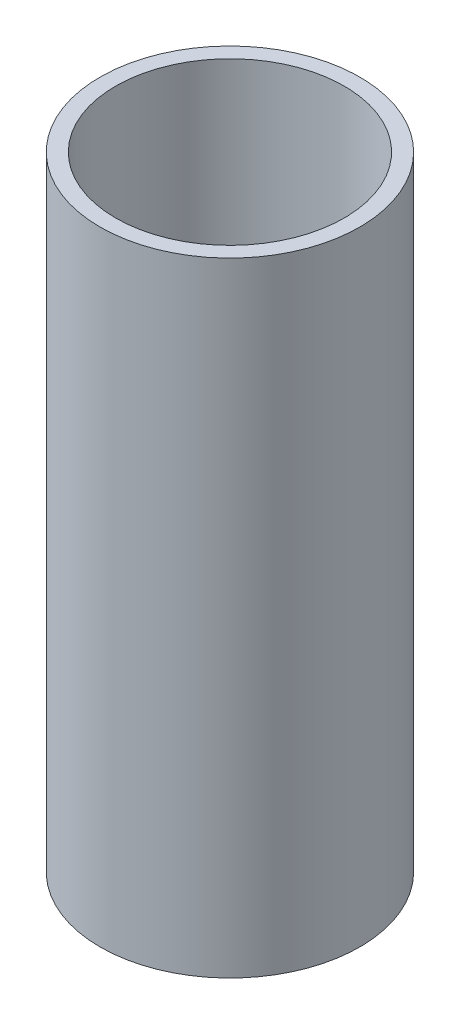
ISO-10303-21;
HEADER;
FILE_DESCRIPTION(('STEP AP214'),'2;1');
FILE_NAME('part.step','',(''),(''),'','','');
FILE_SCHEMA(('AUTOMOTIVE_DESIGN { 1 0 10303 214 1 1 1 1 }'));
ENDSEC;
DATA;
#1=APPLICATION_CONTEXT('core data for automotive mechanical design processes');
#2=APPLICATION_PROTOCOL_DEFINITION('international standard','automotive_design',2000,#1);
#3=PRODUCT_CONTEXT('',#1,'mechanical');
#4=PRODUCT('Part','Part','',(#3));
#5=PRODUCT_RELATED_PRODUCT_CATEGORY('part','',(#4));
#6=PRODUCT_DEFINITION_FORMATION('','',#4);
#7=PRODUCT_DEFINITION_CONTEXT('part definition',#1,'design');
#8=PRODUCT_DEFINITION('design','',#6,#7);
#9=PRODUCT_DEFINITION_SHAPE('','',#8);
#10=(LENGTH_UNIT() NAMED_UNIT(*) SI_UNIT(.MILLI.,.METRE.));
#11=(NAMED_UNIT(*) PLANE_ANGLE_UNIT() SI_UNIT($,.RADIAN.));
#12=(NAMED_UNIT(*) SI_UNIT($,.STERADIAN.) SOLID_ANGLE_UNIT());
#13=UNCERTAINTY_MEASURE_WITH_UNIT(LENGTH_MEASURE(1.E-05),#10,'distance_accuracy_value','');
#14=(GEOMETRIC_REPRESENTATION_CONTEXT(3) GLOBAL_UNCERTAINTY_ASSIGNED_CONTEXT((#13)) GLOBAL_UNIT_ASSIGNED_CONTEXT((#10,
#11,#12)) REPRESENTATION_CONTEXT('',''));
#15=CARTESIAN_POINT('',(0.,0.,0.));
#16=DIRECTION('',(0.,0.,1.));
#17=DIRECTION('',(1.,0.,0.));
#18=AXIS2_PLACEMENT_3D('',#15,#16,#17);
#19=CARTESIAN_POINT('',(0.,120.,0.));
#20=DIRECTION('',(0.,1.,0.));
#21=DIRECTION('',(0.,0.,1.));
#22=AXIS2_PLACEMENT_3D('',#19,#20,#21);
#23=PLANE('',#22);
#24=CARTESIAN_POINT('',(0.,120.,0.));
#25=DIRECTION('',(0.,1.,0.));
#26=DIRECTION('',(0.,0.,1.));
#27=AXIS2_PLACEMENT_3D('',#24,#25,#26);
#28=CIRCLE('',#27,25.);
#29=CARTESIAN_POINT('',(0.,120.,25.));
#30=VERTEX_POINT('',#29);
#31=EDGE_CURVE('E10',#30,#30,#28,.T.);
#32=ORIENTED_EDGE('',*,*,#31,.T.);
#33=EDGE_LOOP('',(#32));
#34=FACE_BOUND('',#33,.T.);
#35=CARTESIAN_POINT('',(0.,120.,0.));
#36=DIRECTION('',(0.,1.,0.));
#37=DIRECTION('',(0.,0.,1.));
#38=AXIS2_PLACEMENT_3D('',#35,#36,#37);
#39=CIRCLE('',#38,22.);
#40=CARTESIAN_POINT('',(0.,120.,22.));
#41=VERTEX_POINT('',#40);
#42=EDGE_CURVE('E42',#41,#41,#39,.T.);
#43=ORIENTED_EDGE('',*,*,#42,.F.);
#44=EDGE_LOOP('',(#43));
#45=FACE_BOUND('',#44,.T.);
#46=ADVANCED_FACE('F31',(#34,#45),#23,.T.);
#47=CARTESIAN_POINT('',(0.,0.,0.));
#48=DIRECTION('',(0.,1.,0.));
#49=DIRECTION('',(0.,0.,1.));
#50=AXIS2_PLACEMENT_3D('',#47,#48,#49);
#51=PLANE('',#50);
#52=CARTESIAN_POINT('',(0.,0.,0.));
#53=DIRECTION('',(0.,1.,0.));
#54=DIRECTION('',(0.,0.,1.));
#55=AXIS2_PLACEMENT_3D('',#52,#53,#54);
#56=CIRCLE('',#55,25.);
#57=CARTESIAN_POINT('',(0.,0.,25.));
#58=VERTEX_POINT('',#57);
#59=EDGE_CURVE('E35',#58,#58,#56,.T.);
#60=ORIENTED_EDGE('',*,*,#59,.F.);
#61=EDGE_LOOP('',(#60));
#62=FACE_BOUND('',#61,.T.);
#63=CARTESIAN_POINT('',(0.,0.,0.));
#64=DIRECTION('',(0.,1.,0.));
#65=DIRECTION('',(0.,0.,1.));
#66=AXIS2_PLACEMENT_3D('',#63,#64,#65);
#67=CIRCLE('',#66,22.);
#68=CARTESIAN_POINT('',(0.,0.,22.));
#69=VERTEX_POINT('',#68);
#70=EDGE_CURVE('E44',#69,#69,#67,.T.);
#71=ORIENTED_EDGE('',*,*,#70,.T.);
#72=EDGE_LOOP('',(#71));
#73=FACE_BOUND('',#72,.T.);
#74=ADVANCED_FACE('F54',(#62,#73),#51,.F.);
#75=CARTESIAN_POINT('',(0.,120.,0.));
#76=DIRECTION('',(0.,-1.,0.));
#77=DIRECTION('',(0.,0.,-1.));
#78=AXIS2_PLACEMENT_3D('',#75,#76,#77);
#79=CYLINDRICAL_SURFACE('',#78,25.);
#80=ORIENTED_EDGE('',*,*,#31,.F.);
#81=EDGE_LOOP('',(#80));
#82=FACE_BOUND('',#81,.T.);
#83=ORIENTED_EDGE('',*,*,#59,.T.);
#84=EDGE_LOOP('',(#83));
#85=FACE_BOUND('',#84,.T.);
#86=ADVANCED_FACE('F33',(#82,#85),#79,.T.);
#87=CARTESIAN_POINT('',(0.,120.,0.));
#88=DIRECTION('',(0.,-1.,0.));
#89=DIRECTION('',(0.,0.,-1.));
#90=AXIS2_PLACEMENT_3D('',#87,#88,#89);
#91=CYLINDRICAL_SURFACE('',#90,22.);
#92=ORIENTED_EDGE('',*,*,#42,.T.);
#93=EDGE_LOOP('',(#92));
#94=FACE_BOUND('',#93,.T.);
#95=ORIENTED_EDGE('',*,*,#70,.F.);
#96=EDGE_LOOP('',(#95));
#97=FACE_BOUND('',#96,.T.);
#98=ADVANCED_FACE('F50',(#94,#97),#91,.F.);
#99=CLOSED_SHELL('',(#46,#74,#86,#98));
#100=MANIFOLD_SOLID_BREP('B2',#99);
#101=ADVANCED_BREP_SHAPE_REPRESENTATION('',(#18,#100),#14);
#102=SHAPE_DEFINITION_REPRESENTATION(#9,#101);
ENDSEC;
END-ISO-10303-21;
